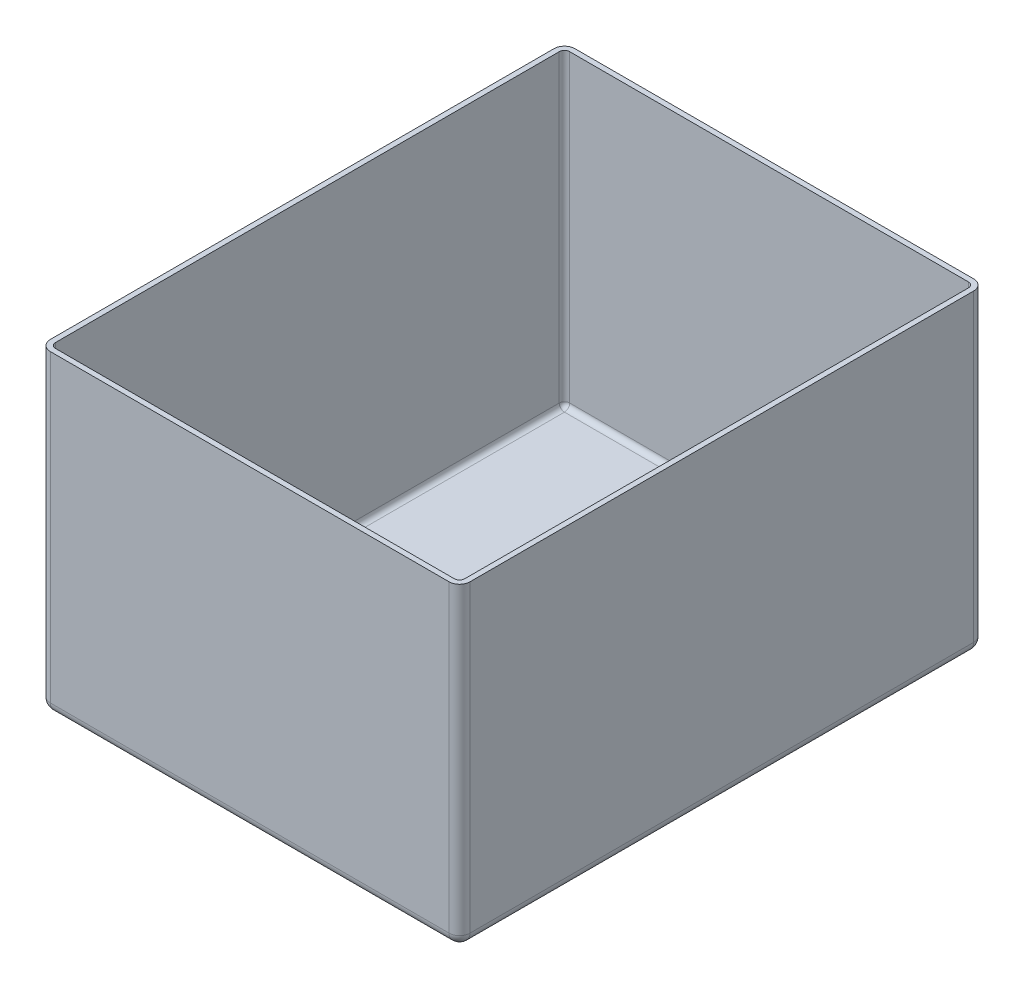
ISO-10303-21;
HEADER;
FILE_DESCRIPTION(('STEP AP214'),'2;1');
FILE_NAME('part.step','',(''),(''),'','','');
FILE_SCHEMA(('AUTOMOTIVE_DESIGN { 1 0 10303 214 1 1 1 1 }'));
ENDSEC;
DATA;
#1=APPLICATION_CONTEXT('core data for automotive mechanical design processes');
#2=APPLICATION_PROTOCOL_DEFINITION('international standard','automotive_design',2000,#1);
#3=PRODUCT_CONTEXT('',#1,'mechanical');
#4=PRODUCT('Part','Part','',(#3));
#5=PRODUCT_RELATED_PRODUCT_CATEGORY('part','',(#4));
#6=PRODUCT_DEFINITION_FORMATION('','',#4);
#7=PRODUCT_DEFINITION_CONTEXT('part definition',#1,'design');
#8=PRODUCT_DEFINITION('design','',#6,#7);
#9=PRODUCT_DEFINITION_SHAPE('','',#8);
#10=(LENGTH_UNIT() NAMED_UNIT(*) SI_UNIT(.MILLI.,.METRE.));
#11=(NAMED_UNIT(*) PLANE_ANGLE_UNIT() SI_UNIT($,.RADIAN.));
#12=(NAMED_UNIT(*) SI_UNIT($,.STERADIAN.) SOLID_ANGLE_UNIT());
#13=UNCERTAINTY_MEASURE_WITH_UNIT(LENGTH_MEASURE(1.E-05),#10,'distance_accuracy_value','');
#14=(GEOMETRIC_REPRESENTATION_CONTEXT(3) GLOBAL_UNCERTAINTY_ASSIGNED_CONTEXT((#13)) GLOBAL_UNIT_ASSIGNED_CONTEXT((#10,
#11,#12)) REPRESENTATION_CONTEXT('',''));
#15=CARTESIAN_POINT('',(0.,0.,0.));
#16=DIRECTION('',(0.,0.,1.));
#17=DIRECTION('',(1.,0.,0.));
#18=AXIS2_PLACEMENT_3D('',#15,#16,#17);
#19=CARTESIAN_POINT('',(-200.,300.,250.));
#20=DIRECTION('',(1.,0.,0.));
#21=DIRECTION('',(0.,0.,-1.));
#22=AXIS2_PLACEMENT_3D('',#19,#20,#21);
#23=PLANE('',#22);
#24=DIRECTION('',(0.,0.,1.));
#25=VECTOR('',#24,1.);
#26=CARTESIAN_POINT('',(-200.,300.,250.));
#27=LINE('',#26,#25);
#28=CARTESIAN_POINT('',(-200.,300.,-240.));
#29=VERTEX_POINT('',#28);
#30=CARTESIAN_POINT('',(-200.,300.,240.));
#31=VERTEX_POINT('',#30);
#32=EDGE_CURVE('E276',#29,#31,#27,.T.);
#33=ORIENTED_EDGE('',*,*,#32,.F.);
#34=DIRECTION('',(0.,-1.,0.));
#35=VECTOR('',#34,1.);
#36=CARTESIAN_POINT('',(-200.,300.,-240.));
#37=LINE('',#36,#35);
#38=CARTESIAN_POINT('',(-200.,10.,-240.));
#39=VERTEX_POINT('',#38);
#40=EDGE_CURVE('E56',#29,#39,#37,.T.);
#41=ORIENTED_EDGE('',*,*,#40,.T.);
#42=DIRECTION('',(0.,0.,1.));
#43=VECTOR('',#42,1.);
#44=CARTESIAN_POINT('',(-200.,10.,250.));
#45=LINE('',#44,#43);
#46=CARTESIAN_POINT('',(-200.,10.,240.));
#47=VERTEX_POINT('',#46);
#48=EDGE_CURVE('E318',#39,#47,#45,.T.);
#49=ORIENTED_EDGE('',*,*,#48,.T.);
#50=DIRECTION('',(0.,-1.,0.));
#51=VECTOR('',#50,1.);
#52=CARTESIAN_POINT('',(-200.,300.,240.));
#53=LINE('',#52,#51);
#54=EDGE_CURVE('E316',#47,#31,#53,.F.);
#55=ORIENTED_EDGE('',*,*,#54,.T.);
#56=EDGE_LOOP('',(#33,#41,#49,#55));
#57=FACE_BOUND('',#56,.T.);
#58=ADVANCED_FACE('F31',(#57),#23,.F.);
#59=CARTESIAN_POINT('',(200.,300.,250.));
#60=DIRECTION('',(0.,0.,-1.));
#61=DIRECTION('',(-1.,0.,0.));
#62=AXIS2_PLACEMENT_3D('',#59,#60,#61);
#63=PLANE('',#62);
#64=DIRECTION('',(1.,0.,0.));
#65=VECTOR('',#64,1.);
#66=CARTESIAN_POINT('',(200.,10.,250.));
#67=LINE('',#66,#65);
#68=CARTESIAN_POINT('',(-190.,10.,250.));
#69=VERTEX_POINT('',#68);
#70=CARTESIAN_POINT('',(190.,10.,250.));
#71=VERTEX_POINT('',#70);
#72=EDGE_CURVE('E290',#69,#71,#67,.T.);
#73=ORIENTED_EDGE('',*,*,#72,.T.);
#74=DIRECTION('',(0.,-1.,0.));
#75=VECTOR('',#74,1.);
#76=CARTESIAN_POINT('',(190.,300.,250.));
#77=LINE('',#76,#75);
#78=CARTESIAN_POINT('',(190.,300.,250.));
#79=VERTEX_POINT('',#78);
#80=EDGE_CURVE('E293',#71,#79,#77,.F.);
#81=ORIENTED_EDGE('',*,*,#80,.T.);
#82=DIRECTION('',(1.,0.,0.));
#83=VECTOR('',#82,1.);
#84=CARTESIAN_POINT('',(200.,300.,250.));
#85=LINE('',#84,#83);
#86=CARTESIAN_POINT('',(-190.,300.,250.));
#87=VERTEX_POINT('',#86);
#88=EDGE_CURVE('E279',#87,#79,#85,.T.);
#89=ORIENTED_EDGE('',*,*,#88,.F.);
#90=DIRECTION('',(0.,-1.,0.));
#91=VECTOR('',#90,1.);
#92=CARTESIAN_POINT('',(-190.,300.,250.));
#93=LINE('',#92,#91);
#94=EDGE_CURVE('E288',#87,#69,#93,.T.);
#95=ORIENTED_EDGE('',*,*,#94,.T.);
#96=EDGE_LOOP('',(#73,#81,#89,#95));
#97=FACE_BOUND('',#96,.T.);
#98=ADVANCED_FACE('F379',(#97),#63,.F.);
#99=CARTESIAN_POINT('',(200.,300.,250.));
#100=DIRECTION('',(-1.,0.,0.));
#101=DIRECTION('',(0.,0.,1.));
#102=AXIS2_PLACEMENT_3D('',#99,#100,#101);
#103=PLANE('',#102);
#104=DIRECTION('',(0.,0.,-1.));
#105=VECTOR('',#104,1.);
#106=CARTESIAN_POINT('',(200.,10.,250.));
#107=LINE('',#106,#105);
#108=CARTESIAN_POINT('',(200.,10.,240.));
#109=VERTEX_POINT('',#108);
#110=CARTESIAN_POINT('',(200.,10.,-240.));
#111=VERTEX_POINT('',#110);
#112=EDGE_CURVE('E306',#109,#111,#107,.T.);
#113=ORIENTED_EDGE('',*,*,#112,.T.);
#114=DIRECTION('',(0.,-1.,0.));
#115=VECTOR('',#114,1.);
#116=CARTESIAN_POINT('',(200.,300.,-240.));
#117=LINE('',#116,#115);
#118=CARTESIAN_POINT('',(200.,300.,-240.));
#119=VERTEX_POINT('',#118);
#120=EDGE_CURVE('E308',#111,#119,#117,.F.);
#121=ORIENTED_EDGE('',*,*,#120,.T.);
#122=DIRECTION('',(0.,0.,-1.));
#123=VECTOR('',#122,1.);
#124=CARTESIAN_POINT('',(200.,300.,250.));
#125=LINE('',#124,#123);
#126=CARTESIAN_POINT('',(200.,300.,240.));
#127=VERTEX_POINT('',#126);
#128=EDGE_CURVE('E282',#127,#119,#125,.T.);
#129=ORIENTED_EDGE('',*,*,#128,.F.);
#130=DIRECTION('',(0.,-1.,0.));
#131=VECTOR('',#130,1.);
#132=CARTESIAN_POINT('',(200.,300.,240.));
#133=LINE('',#132,#131);
#134=EDGE_CURVE('E304',#127,#109,#133,.T.);
#135=ORIENTED_EDGE('',*,*,#134,.T.);
#136=EDGE_LOOP('',(#113,#121,#129,#135));
#137=FACE_BOUND('',#136,.T.);
#138=ADVANCED_FACE('F389',(#137),#103,.F.);
#139=CARTESIAN_POINT('',(200.,300.,-250.));
#140=DIRECTION('',(0.,0.,1.));
#141=DIRECTION('',(1.,0.,0.));
#142=AXIS2_PLACEMENT_3D('',#139,#140,#141);
#143=PLANE('',#142);
#144=DIRECTION('',(-1.,0.,0.));
#145=VECTOR('',#144,1.);
#146=CARTESIAN_POINT('',(200.,10.,-250.));
#147=LINE('',#146,#145);
#148=CARTESIAN_POINT('',(190.,10.,-250.));
#149=VERTEX_POINT('',#148);
#150=CARTESIAN_POINT('',(-190.,10.,-250.));
#151=VERTEX_POINT('',#150);
#152=EDGE_CURVE('E312',#149,#151,#147,.T.);
#153=ORIENTED_EDGE('',*,*,#152,.T.);
#154=DIRECTION('',(0.,-1.,0.));
#155=VECTOR('',#154,1.);
#156=CARTESIAN_POINT('',(-190.,300.,-250.));
#157=LINE('',#156,#155);
#158=CARTESIAN_POINT('',(-190.,300.,-250.));
#159=VERTEX_POINT('',#158);
#160=EDGE_CURVE('E314',#151,#159,#157,.F.);
#161=ORIENTED_EDGE('',*,*,#160,.T.);
#162=DIRECTION('',(-1.,0.,0.));
#163=VECTOR('',#162,1.);
#164=CARTESIAN_POINT('',(200.,300.,-250.));
#165=LINE('',#164,#163);
#166=CARTESIAN_POINT('',(190.,300.,-250.));
#167=VERTEX_POINT('',#166);
#168=EDGE_CURVE('E285',#167,#159,#165,.T.);
#169=ORIENTED_EDGE('',*,*,#168,.F.);
#170=DIRECTION('',(0.,-1.,0.));
#171=VECTOR('',#170,1.);
#172=CARTESIAN_POINT('',(190.,300.,-250.));
#173=LINE('',#172,#171);
#174=EDGE_CURVE('E310',#167,#149,#173,.T.);
#175=ORIENTED_EDGE('',*,*,#174,.T.);
#176=EDGE_LOOP('',(#153,#161,#169,#175));
#177=FACE_BOUND('',#176,.T.);
#178=ADVANCED_FACE('F410',(#177),#143,.F.);
#179=CARTESIAN_POINT('',(-200.,300.,-250.));
#180=DIRECTION('',(0.,1.,0.));
#181=DIRECTION('',(0.,0.,1.));
#182=AXIS2_PLACEMENT_3D('',#179,#180,#181);
#183=PLANE('',#182);
#184=DIRECTION('',(-1.,0.,0.));
#185=VECTOR('',#184,1.);
#186=CARTESIAN_POINT('',(200.,300.,-245.));
#187=LINE('',#186,#185);
#188=CARTESIAN_POINT('',(190.,300.,-245.));
#189=VERTEX_POINT('',#188);
#190=CARTESIAN_POINT('',(-190.,300.,-245.));
#191=VERTEX_POINT('',#190);
#192=EDGE_CURVE('E249',#189,#191,#187,.T.);
#193=ORIENTED_EDGE('',*,*,#192,.F.);
#194=CARTESIAN_POINT('',(190.,300.,-240.));
#195=DIRECTION('',(0.,1.,0.));
#196=DIRECTION('',(0.,0.,1.));
#197=AXIS2_PLACEMENT_3D('',#194,#195,#196);
#198=CIRCLE('',#197,5.);
#199=CARTESIAN_POINT('',(195.,300.,-240.));
#200=VERTEX_POINT('',#199);
#201=EDGE_CURVE('E269',#200,#189,#198,.T.);
#202=ORIENTED_EDGE('',*,*,#201,.F.);
#203=DIRECTION('',(0.,0.,-1.));
#204=VECTOR('',#203,1.);
#205=CARTESIAN_POINT('',(195.,300.,250.));
#206=LINE('',#205,#204);
#207=CARTESIAN_POINT('',(195.,300.,240.));
#208=VERTEX_POINT('',#207);
#209=EDGE_CURVE('E48',#208,#200,#206,.T.);
#210=ORIENTED_EDGE('',*,*,#209,.F.);
#211=CARTESIAN_POINT('',(190.,300.,240.));
#212=DIRECTION('',(0.,1.,0.));
#213=DIRECTION('',(0.,0.,1.));
#214=AXIS2_PLACEMENT_3D('',#211,#212,#213);
#215=CIRCLE('',#214,5.);
#216=CARTESIAN_POINT('',(190.,300.,245.));
#217=VERTEX_POINT('',#216);
#218=EDGE_CURVE('E265',#217,#208,#215,.T.);
#219=ORIENTED_EDGE('',*,*,#218,.F.);
#220=DIRECTION('',(1.,0.,0.));
#221=VECTOR('',#220,1.);
#222=CARTESIAN_POINT('',(200.,300.,245.));
#223=LINE('',#222,#221);
#224=CARTESIAN_POINT('',(-190.,300.,245.));
#225=VERTEX_POINT('',#224);
#226=EDGE_CURVE('E263',#225,#217,#223,.T.);
#227=ORIENTED_EDGE('',*,*,#226,.F.);
#228=CARTESIAN_POINT('',(-190.,300.,240.));
#229=DIRECTION('',(0.,1.,0.));
#230=DIRECTION('',(0.,0.,1.));
#231=AXIS2_PLACEMENT_3D('',#228,#229,#230);
#232=CIRCLE('',#231,5.);
#233=CARTESIAN_POINT('',(-195.,300.,240.));
#234=VERTEX_POINT('',#233);
#235=EDGE_CURVE('E182',#234,#225,#232,.T.);
#236=ORIENTED_EDGE('',*,*,#235,.F.);
#237=DIRECTION('',(0.,0.,1.));
#238=VECTOR('',#237,1.);
#239=CARTESIAN_POINT('',(-195.,300.,250.));
#240=LINE('',#239,#238);
#241=CARTESIAN_POINT('',(-195.,300.,-240.));
#242=VERTEX_POINT('',#241);
#243=EDGE_CURVE('E239',#242,#234,#240,.T.);
#244=ORIENTED_EDGE('',*,*,#243,.F.);
#245=CARTESIAN_POINT('',(-190.,300.,-240.));
#246=DIRECTION('',(0.,1.,0.));
#247=DIRECTION('',(0.,0.,1.));
#248=AXIS2_PLACEMENT_3D('',#245,#246,#247);
#249=CIRCLE('',#248,5.);
#250=EDGE_CURVE('E177',#191,#242,#249,.T.);
#251=ORIENTED_EDGE('',*,*,#250,.F.);
#252=EDGE_LOOP('',(#193,#202,#210,#219,#227,#236,#244,#251));
#253=FACE_BOUND('',#252,.T.);
#254=ORIENTED_EDGE('',*,*,#168,.T.);
#255=CARTESIAN_POINT('',(-190.,300.,-240.));
#256=DIRECTION('',(0.,1.,0.));
#257=DIRECTION('',(0.,0.,1.));
#258=AXIS2_PLACEMENT_3D('',#255,#256,#257);
#259=CIRCLE('',#258,10.);
#260=EDGE_CURVE('E11',#159,#29,#259,.T.);
#261=ORIENTED_EDGE('',*,*,#260,.T.);
#262=ORIENTED_EDGE('',*,*,#32,.T.);
#263=CARTESIAN_POINT('',(-190.,300.,240.));
#264=DIRECTION('',(0.,1.,0.));
#265=DIRECTION('',(0.,0.,1.));
#266=AXIS2_PLACEMENT_3D('',#263,#264,#265);
#267=CIRCLE('',#266,10.);
#268=EDGE_CURVE('E321',#31,#87,#267,.T.);
#269=ORIENTED_EDGE('',*,*,#268,.T.);
#270=ORIENTED_EDGE('',*,*,#88,.T.);
#271=CARTESIAN_POINT('',(190.,300.,240.));
#272=DIRECTION('',(0.,1.,0.));
#273=DIRECTION('',(0.,0.,1.));
#274=AXIS2_PLACEMENT_3D('',#271,#272,#273);
#275=CIRCLE('',#274,10.);
#276=EDGE_CURVE('E323',#79,#127,#275,.T.);
#277=ORIENTED_EDGE('',*,*,#276,.T.);
#278=ORIENTED_EDGE('',*,*,#128,.T.);
#279=CARTESIAN_POINT('',(190.,300.,-240.));
#280=DIRECTION('',(0.,1.,0.));
#281=DIRECTION('',(0.,0.,1.));
#282=AXIS2_PLACEMENT_3D('',#279,#280,#281);
#283=CIRCLE('',#282,10.);
#284=EDGE_CURVE('E40',#119,#167,#283,.T.);
#285=ORIENTED_EDGE('',*,*,#284,.T.);
#286=EDGE_LOOP('',(#254,#261,#262,#269,#270,#277,#278,#285));
#287=FACE_BOUND('',#286,.T.);
#288=ADVANCED_FACE('F376',(#253,#287),#183,.T.);
#289=CARTESIAN_POINT('',(-200.,0.,-250.));
#290=DIRECTION('',(0.,1.,0.));
#291=DIRECTION('',(0.,0.,1.));
#292=AXIS2_PLACEMENT_3D('',#289,#290,#291);
#293=PLANE('',#292);
#294=DIRECTION('',(0.,0.,-1.));
#295=VECTOR('',#294,1.);
#296=CARTESIAN_POINT('',(190.,0.,-250.));
#297=LINE('',#296,#295);
#298=CARTESIAN_POINT('',(190.,0.,-240.));
#299=VERTEX_POINT('',#298);
#300=CARTESIAN_POINT('',(190.,0.,240.));
#301=VERTEX_POINT('',#300);
#302=EDGE_CURVE('E299',#299,#301,#297,.F.);
#303=ORIENTED_EDGE('',*,*,#302,.T.);
#304=DIRECTION('',(1.,0.,0.));
#305=VECTOR('',#304,1.);
#306=CARTESIAN_POINT('',(-200.,0.,240.));
#307=LINE('',#306,#305);
#308=CARTESIAN_POINT('',(-190.,0.,240.));
#309=VERTEX_POINT('',#308);
#310=EDGE_CURVE('E301',#301,#309,#307,.F.);
#311=ORIENTED_EDGE('',*,*,#310,.T.);
#312=DIRECTION('',(0.,0.,1.));
#313=VECTOR('',#312,1.);
#314=CARTESIAN_POINT('',(-190.,0.,-250.));
#315=LINE('',#314,#313);
#316=CARTESIAN_POINT('',(-190.,0.,-240.));
#317=VERTEX_POINT('',#316);
#318=EDGE_CURVE('E295',#309,#317,#315,.F.);
#319=ORIENTED_EDGE('',*,*,#318,.T.);
#320=DIRECTION('',(-1.,0.,0.));
#321=VECTOR('',#320,1.);
#322=CARTESIAN_POINT('',(-200.,0.,-240.));
#323=LINE('',#322,#321);
#324=EDGE_CURVE('E297',#317,#299,#323,.F.);
#325=ORIENTED_EDGE('',*,*,#324,.T.);
#326=EDGE_LOOP('',(#303,#311,#319,#325));
#327=FACE_BOUND('',#326,.T.);
#328=ADVANCED_FACE('F406',(#327),#293,.F.);
#329=CARTESIAN_POINT('',(-190.,300.,-240.));
#330=DIRECTION('',(0.,-1.,0.));
#331=DIRECTION('',(0.,0.,-1.));
#332=AXIS2_PLACEMENT_3D('',#329,#330,#331);
#333=CYLINDRICAL_SURFACE('',#332,10.);
#334=ORIENTED_EDGE('',*,*,#260,.F.);
#335=ORIENTED_EDGE('',*,*,#160,.F.);
#336=CARTESIAN_POINT('',(-190.,10.,-240.));
#337=DIRECTION('',(0.,-1.,0.));
#338=DIRECTION('',(0.,0.,-1.));
#339=AXIS2_PLACEMENT_3D('',#336,#337,#338);
#340=CIRCLE('',#339,10.);
#341=EDGE_CURVE('E352',#39,#151,#340,.T.);
#342=ORIENTED_EDGE('',*,*,#341,.F.);
#343=ORIENTED_EDGE('',*,*,#40,.F.);
#344=EDGE_LOOP('',(#334,#335,#342,#343));
#345=FACE_BOUND('',#344,.T.);
#346=ADVANCED_FACE('F33',(#345),#333,.T.);
#347=CARTESIAN_POINT('',(190.,300.,-240.));
#348=DIRECTION('',(0.,-1.,0.));
#349=DIRECTION('',(0.,0.,-1.));
#350=AXIS2_PLACEMENT_3D('',#347,#348,#349);
#351=CYLINDRICAL_SURFACE('',#350,10.);
#352=ORIENTED_EDGE('',*,*,#284,.F.);
#353=ORIENTED_EDGE('',*,*,#120,.F.);
#354=CARTESIAN_POINT('',(190.,10.,-240.));
#355=DIRECTION('',(0.,-1.,0.));
#356=DIRECTION('',(0.,0.,-1.));
#357=AXIS2_PLACEMENT_3D('',#354,#355,#356);
#358=CIRCLE('',#357,10.);
#359=EDGE_CURVE('E350',#149,#111,#358,.T.);
#360=ORIENTED_EDGE('',*,*,#359,.F.);
#361=ORIENTED_EDGE('',*,*,#174,.F.);
#362=EDGE_LOOP('',(#352,#353,#360,#361));
#363=FACE_BOUND('',#362,.T.);
#364=ADVANCED_FACE('F394',(#363),#351,.T.);
#365=CARTESIAN_POINT('',(200.,10.,-240.));
#366=DIRECTION('',(-1.,0.,0.));
#367=DIRECTION('',(0.,0.,1.));
#368=AXIS2_PLACEMENT_3D('',#365,#366,#367);
#369=CYLINDRICAL_SURFACE('',#368,10.);
#370=CARTESIAN_POINT('',(-190.,10.,-240.));
#371=DIRECTION('',(-1.,0.,0.));
#372=DIRECTION('',(0.,0.,1.));
#373=AXIS2_PLACEMENT_3D('',#370,#371,#372);
#374=CIRCLE('',#373,10.);
#375=EDGE_CURVE('E35',#151,#317,#374,.T.);
#376=ORIENTED_EDGE('',*,*,#375,.F.);
#377=ORIENTED_EDGE('',*,*,#152,.F.);
#378=CARTESIAN_POINT('',(190.,10.,-240.));
#379=DIRECTION('',(1.,0.,0.));
#380=DIRECTION('',(0.,0.,-1.));
#381=AXIS2_PLACEMENT_3D('',#378,#379,#380);
#382=CIRCLE('',#381,10.);
#383=EDGE_CURVE('E347',#299,#149,#382,.T.);
#384=ORIENTED_EDGE('',*,*,#383,.F.);
#385=ORIENTED_EDGE('',*,*,#324,.F.);
#386=EDGE_LOOP('',(#376,#377,#384,#385));
#387=FACE_BOUND('',#386,.T.);
#388=ADVANCED_FACE('F407',(#387),#369,.T.);
#389=CARTESIAN_POINT('',(-190.,10.,-240.));
#390=DIRECTION('',(0.,0.,1.));
#391=DIRECTION('',(1.,0.,0.));
#392=AXIS2_PLACEMENT_3D('',#389,#390,#391);
#393=SPHERICAL_SURFACE('',#392,10.);
#394=ORIENTED_EDGE('',*,*,#341,.T.);
#395=ORIENTED_EDGE('',*,*,#375,.T.);
#396=CARTESIAN_POINT('',(-190.,10.,-240.));
#397=DIRECTION('',(0.,0.,-1.));
#398=DIRECTION('',(-1.,0.,0.));
#399=AXIS2_PLACEMENT_3D('',#396,#397,#398);
#400=CIRCLE('',#399,10.);
#401=EDGE_CURVE('E344',#39,#317,#400,.F.);
#402=ORIENTED_EDGE('',*,*,#401,.F.);
#403=EDGE_LOOP('',(#394,#395,#402));
#404=FACE_BOUND('',#403,.T.);
#405=ADVANCED_FACE('F358',(#404),#393,.T.);
#406=CARTESIAN_POINT('',(190.,10.,-240.));
#407=DIRECTION('',(0.,0.,1.));
#408=DIRECTION('',(1.,0.,0.));
#409=AXIS2_PLACEMENT_3D('',#406,#407,#408);
#410=SPHERICAL_SURFACE('',#409,10.);
#411=ORIENTED_EDGE('',*,*,#383,.T.);
#412=ORIENTED_EDGE('',*,*,#359,.T.);
#413=CARTESIAN_POINT('',(190.,10.,-240.));
#414=DIRECTION('',(0.,0.,-1.));
#415=DIRECTION('',(-1.,0.,0.));
#416=AXIS2_PLACEMENT_3D('',#413,#414,#415);
#417=CIRCLE('',#416,10.);
#418=EDGE_CURVE('E341',#299,#111,#417,.F.);
#419=ORIENTED_EDGE('',*,*,#418,.F.);
#420=EDGE_LOOP('',(#411,#412,#419));
#421=FACE_BOUND('',#420,.T.);
#422=ADVANCED_FACE('F398',(#421),#410,.T.);
#423=CARTESIAN_POINT('',(-190.,10.,250.));
#424=DIRECTION('',(0.,0.,1.));
#425=DIRECTION('',(1.,0.,0.));
#426=AXIS2_PLACEMENT_3D('',#423,#424,#425);
#427=CYLINDRICAL_SURFACE('',#426,10.);
#428=ORIENTED_EDGE('',*,*,#401,.T.);
#429=ORIENTED_EDGE('',*,*,#318,.F.);
#430=CARTESIAN_POINT('',(-190.,10.,240.));
#431=DIRECTION('',(0.,0.,1.));
#432=DIRECTION('',(1.,0.,0.));
#433=AXIS2_PLACEMENT_3D('',#430,#431,#432);
#434=CIRCLE('',#433,10.);
#435=EDGE_CURVE('E338',#47,#309,#434,.T.);
#436=ORIENTED_EDGE('',*,*,#435,.F.);
#437=ORIENTED_EDGE('',*,*,#48,.F.);
#438=EDGE_LOOP('',(#428,#429,#436,#437));
#439=FACE_BOUND('',#438,.T.);
#440=ADVANCED_FACE('F365',(#439),#427,.T.);
#441=CARTESIAN_POINT('',(-190.,300.,240.));
#442=DIRECTION('',(0.,-1.,0.));
#443=DIRECTION('',(0.,0.,-1.));
#444=AXIS2_PLACEMENT_3D('',#441,#442,#443);
#445=CYLINDRICAL_SURFACE('',#444,10.);
#446=ORIENTED_EDGE('',*,*,#268,.F.);
#447=ORIENTED_EDGE('',*,*,#54,.F.);
#448=CARTESIAN_POINT('',(-190.,10.,240.));
#449=DIRECTION('',(0.,-1.,0.));
#450=DIRECTION('',(0.,0.,-1.));
#451=AXIS2_PLACEMENT_3D('',#448,#449,#450);
#452=CIRCLE('',#451,10.);
#453=EDGE_CURVE('E335',#69,#47,#452,.T.);
#454=ORIENTED_EDGE('',*,*,#453,.F.);
#455=ORIENTED_EDGE('',*,*,#94,.F.);
#456=EDGE_LOOP('',(#446,#447,#454,#455));
#457=FACE_BOUND('',#456,.T.);
#458=ADVANCED_FACE('F371',(#457),#445,.T.);
#459=CARTESIAN_POINT('',(190.,300.,240.));
#460=DIRECTION('',(0.,-1.,0.));
#461=DIRECTION('',(0.,0.,-1.));
#462=AXIS2_PLACEMENT_3D('',#459,#460,#461);
#463=CYLINDRICAL_SURFACE('',#462,10.);
#464=ORIENTED_EDGE('',*,*,#276,.F.);
#465=ORIENTED_EDGE('',*,*,#80,.F.);
#466=CARTESIAN_POINT('',(190.,10.,240.));
#467=DIRECTION('',(0.,-1.,0.));
#468=DIRECTION('',(0.,0.,-1.));
#469=AXIS2_PLACEMENT_3D('',#466,#467,#468);
#470=CIRCLE('',#469,10.);
#471=EDGE_CURVE('E332',#109,#71,#470,.T.);
#472=ORIENTED_EDGE('',*,*,#471,.F.);
#473=ORIENTED_EDGE('',*,*,#134,.F.);
#474=EDGE_LOOP('',(#464,#465,#472,#473));
#475=FACE_BOUND('',#474,.T.);
#476=ADVANCED_FACE('F384',(#475),#463,.T.);
#477=CARTESIAN_POINT('',(190.,10.,250.));
#478=DIRECTION('',(0.,0.,-1.));
#479=DIRECTION('',(-1.,0.,0.));
#480=AXIS2_PLACEMENT_3D('',#477,#478,#479);
#481=CYLINDRICAL_SURFACE('',#480,10.);
#482=ORIENTED_EDGE('',*,*,#418,.T.);
#483=ORIENTED_EDGE('',*,*,#112,.F.);
#484=CARTESIAN_POINT('',(190.,10.,240.));
#485=DIRECTION('',(0.,0.,1.));
#486=DIRECTION('',(1.,0.,0.));
#487=AXIS2_PLACEMENT_3D('',#484,#485,#486);
#488=CIRCLE('',#487,10.);
#489=EDGE_CURVE('E329',#301,#109,#488,.T.);
#490=ORIENTED_EDGE('',*,*,#489,.F.);
#491=ORIENTED_EDGE('',*,*,#302,.F.);
#492=EDGE_LOOP('',(#482,#483,#490,#491));
#493=FACE_BOUND('',#492,.T.);
#494=ADVANCED_FACE('F402',(#493),#481,.T.);
#495=CARTESIAN_POINT('',(-190.,10.,240.));
#496=DIRECTION('',(0.,0.,1.));
#497=DIRECTION('',(1.,0.,0.));
#498=AXIS2_PLACEMENT_3D('',#495,#496,#497);
#499=SPHERICAL_SURFACE('',#498,10.);
#500=ORIENTED_EDGE('',*,*,#453,.T.);
#501=ORIENTED_EDGE('',*,*,#435,.T.);
#502=CARTESIAN_POINT('',(-190.,10.,240.));
#503=DIRECTION('',(-1.,0.,0.));
#504=DIRECTION('',(0.,0.,1.));
#505=AXIS2_PLACEMENT_3D('',#502,#503,#504);
#506=CIRCLE('',#505,10.);
#507=EDGE_CURVE('E327',#69,#309,#506,.F.);
#508=ORIENTED_EDGE('',*,*,#507,.F.);
#509=EDGE_LOOP('',(#500,#501,#508));
#510=FACE_BOUND('',#509,.T.);
#511=ADVANCED_FACE('F435',(#510),#499,.T.);
#512=CARTESIAN_POINT('',(190.,10.,240.));
#513=DIRECTION('',(0.,0.,1.));
#514=DIRECTION('',(1.,0.,0.));
#515=AXIS2_PLACEMENT_3D('',#512,#513,#514);
#516=SPHERICAL_SURFACE('',#515,10.);
#517=ORIENTED_EDGE('',*,*,#489,.T.);
#518=ORIENTED_EDGE('',*,*,#471,.T.);
#519=CARTESIAN_POINT('',(190.,10.,240.));
#520=DIRECTION('',(1.,0.,0.));
#521=DIRECTION('',(0.,0.,-1.));
#522=AXIS2_PLACEMENT_3D('',#519,#520,#521);
#523=CIRCLE('',#522,10.);
#524=EDGE_CURVE('E275',#301,#71,#523,.F.);
#525=ORIENTED_EDGE('',*,*,#524,.F.);
#526=EDGE_LOOP('',(#517,#518,#525));
#527=FACE_BOUND('',#526,.T.);
#528=ADVANCED_FACE('F431',(#527),#516,.T.);
#529=CARTESIAN_POINT('',(200.,10.,240.));
#530=DIRECTION('',(1.,0.,0.));
#531=DIRECTION('',(0.,0.,-1.));
#532=AXIS2_PLACEMENT_3D('',#529,#530,#531);
#533=CYLINDRICAL_SURFACE('',#532,10.);
#534=ORIENTED_EDGE('',*,*,#507,.T.);
#535=ORIENTED_EDGE('',*,*,#310,.F.);
#536=ORIENTED_EDGE('',*,*,#524,.T.);
#537=ORIENTED_EDGE('',*,*,#72,.F.);
#538=EDGE_LOOP('',(#534,#535,#536,#537));
#539=FACE_BOUND('',#538,.T.);
#540=ADVANCED_FACE('F428',(#539),#533,.T.);
#541=CARTESIAN_POINT('',(-195.,300.,250.));
#542=DIRECTION('',(1.,0.,0.));
#543=DIRECTION('',(0.,0.,-1.));
#544=AXIS2_PLACEMENT_3D('',#541,#542,#543);
#545=PLANE('',#544);
#546=ORIENTED_EDGE('',*,*,#243,.T.);
#547=DIRECTION('',(0.,1.,0.));
#548=VECTOR('',#547,1.);
#549=CARTESIAN_POINT('',(-195.,300.,240.));
#550=LINE('',#549,#548);
#551=CARTESIAN_POINT('',(-195.,10.,240.));
#552=VERTEX_POINT('',#551);
#553=EDGE_CURVE('E206',#552,#234,#550,.T.);
#554=ORIENTED_EDGE('',*,*,#553,.F.);
#555=DIRECTION('',(0.,0.,-1.));
#556=VECTOR('',#555,1.);
#557=CARTESIAN_POINT('',(-195.,10.,250.));
#558=LINE('',#557,#556);
#559=CARTESIAN_POINT('',(-195.,10.,-240.));
#560=VERTEX_POINT('',#559);
#561=EDGE_CURVE('E183',#560,#552,#558,.F.);
#562=ORIENTED_EDGE('',*,*,#561,.F.);
#563=DIRECTION('',(0.,1.,0.));
#564=VECTOR('',#563,1.);
#565=CARTESIAN_POINT('',(-195.,300.,-240.));
#566=LINE('',#565,#564);
#567=EDGE_CURVE('E172',#242,#560,#566,.F.);
#568=ORIENTED_EDGE('',*,*,#567,.F.);
#569=EDGE_LOOP('',(#546,#554,#562,#568));
#570=FACE_BOUND('',#569,.T.);
#571=ADVANCED_FACE('F205',(#570),#545,.T.);
#572=CARTESIAN_POINT('',(200.,300.,245.));
#573=DIRECTION('',(0.,0.,-1.));
#574=DIRECTION('',(-1.,0.,0.));
#575=AXIS2_PLACEMENT_3D('',#572,#573,#574);
#576=PLANE('',#575);
#577=DIRECTION('',(-1.,0.,0.));
#578=VECTOR('',#577,1.);
#579=CARTESIAN_POINT('',(200.,10.,245.));
#580=LINE('',#579,#578);
#581=CARTESIAN_POINT('',(-190.,10.,245.));
#582=VERTEX_POINT('',#581);
#583=CARTESIAN_POINT('',(190.,10.,245.));
#584=VERTEX_POINT('',#583);
#585=EDGE_CURVE('E248',#582,#584,#580,.F.);
#586=ORIENTED_EDGE('',*,*,#585,.F.);
#587=DIRECTION('',(0.,1.,0.));
#588=VECTOR('',#587,1.);
#589=CARTESIAN_POINT('',(-190.,300.,245.));
#590=LINE('',#589,#588);
#591=EDGE_CURVE('E246',#225,#582,#590,.F.);
#592=ORIENTED_EDGE('',*,*,#591,.F.);
#593=ORIENTED_EDGE('',*,*,#226,.T.);
#594=DIRECTION('',(0.,1.,0.));
#595=VECTOR('',#594,1.);
#596=CARTESIAN_POINT('',(190.,300.,245.));
#597=LINE('',#596,#595);
#598=EDGE_CURVE('E237',#584,#217,#597,.T.);
#599=ORIENTED_EDGE('',*,*,#598,.F.);
#600=EDGE_LOOP('',(#586,#592,#593,#599));
#601=FACE_BOUND('',#600,.T.);
#602=ADVANCED_FACE('F500',(#601),#576,.T.);
#603=CARTESIAN_POINT('',(195.,300.,250.));
#604=DIRECTION('',(-1.,0.,0.));
#605=DIRECTION('',(0.,0.,1.));
#606=AXIS2_PLACEMENT_3D('',#603,#604,#605);
#607=PLANE('',#606);
#608=DIRECTION('',(0.,0.,1.));
#609=VECTOR('',#608,1.);
#610=CARTESIAN_POINT('',(195.,10.,250.));
#611=LINE('',#610,#609);
#612=CARTESIAN_POINT('',(195.,10.,240.));
#613=VERTEX_POINT('',#612);
#614=CARTESIAN_POINT('',(195.,10.,-240.));
#615=VERTEX_POINT('',#614);
#616=EDGE_CURVE('E219',#613,#615,#611,.F.);
#617=ORIENTED_EDGE('',*,*,#616,.F.);
#618=DIRECTION('',(0.,1.,0.));
#619=VECTOR('',#618,1.);
#620=CARTESIAN_POINT('',(195.,300.,240.));
#621=LINE('',#620,#619);
#622=EDGE_CURVE('E223',#208,#613,#621,.F.);
#623=ORIENTED_EDGE('',*,*,#622,.F.);
#624=ORIENTED_EDGE('',*,*,#209,.T.);
#625=DIRECTION('',(0.,1.,0.));
#626=VECTOR('',#625,1.);
#627=CARTESIAN_POINT('',(195.,300.,-240.));
#628=LINE('',#627,#626);
#629=EDGE_CURVE('E217',#615,#200,#628,.T.);
#630=ORIENTED_EDGE('',*,*,#629,.F.);
#631=EDGE_LOOP('',(#617,#623,#624,#630));
#632=FACE_BOUND('',#631,.T.);
#633=ADVANCED_FACE('F507',(#632),#607,.T.);
#634=CARTESIAN_POINT('',(200.,300.,-245.));
#635=DIRECTION('',(0.,0.,1.));
#636=DIRECTION('',(1.,0.,0.));
#637=AXIS2_PLACEMENT_3D('',#634,#635,#636);
#638=PLANE('',#637);
#639=DIRECTION('',(1.,0.,0.));
#640=VECTOR('',#639,1.);
#641=CARTESIAN_POINT('',(200.,10.,-245.));
#642=LINE('',#641,#640);
#643=CARTESIAN_POINT('',(190.,10.,-245.));
#644=VERTEX_POINT('',#643);
#645=CARTESIAN_POINT('',(-190.,10.,-245.));
#646=VERTEX_POINT('',#645);
#647=EDGE_CURVE('E212',#644,#646,#642,.F.);
#648=ORIENTED_EDGE('',*,*,#647,.F.);
#649=DIRECTION('',(0.,1.,0.));
#650=VECTOR('',#649,1.);
#651=CARTESIAN_POINT('',(190.,300.,-245.));
#652=LINE('',#651,#650);
#653=EDGE_CURVE('E215',#189,#644,#652,.F.);
#654=ORIENTED_EDGE('',*,*,#653,.F.);
#655=ORIENTED_EDGE('',*,*,#192,.T.);
#656=DIRECTION('',(0.,1.,0.));
#657=VECTOR('',#656,1.);
#658=CARTESIAN_POINT('',(-190.,300.,-245.));
#659=LINE('',#658,#657);
#660=EDGE_CURVE('E209',#646,#191,#659,.T.);
#661=ORIENTED_EDGE('',*,*,#660,.F.);
#662=EDGE_LOOP('',(#648,#654,#655,#661));
#663=FACE_BOUND('',#662,.T.);
#664=ADVANCED_FACE('F515',(#663),#638,.T.);
#665=CARTESIAN_POINT('',(-200.,5.,-250.));
#666=DIRECTION('',(0.,1.,0.));
#667=DIRECTION('',(0.,0.,1.));
#668=AXIS2_PLACEMENT_3D('',#665,#666,#667);
#669=PLANE('',#668);
#670=DIRECTION('',(0.,0.,1.));
#671=VECTOR('',#670,1.);
#672=CARTESIAN_POINT('',(190.,5.,-250.));
#673=LINE('',#672,#671);
#674=CARTESIAN_POINT('',(190.,5.,-240.));
#675=VERTEX_POINT('',#674);
#676=CARTESIAN_POINT('',(190.,5.,240.));
#677=VERTEX_POINT('',#676);
#678=EDGE_CURVE('E231',#675,#677,#673,.T.);
#679=ORIENTED_EDGE('',*,*,#678,.F.);
#680=DIRECTION('',(1.,0.,0.));
#681=VECTOR('',#680,1.);
#682=CARTESIAN_POINT('',(-200.,5.,-240.));
#683=LINE('',#682,#681);
#684=CARTESIAN_POINT('',(-190.,5.,-240.));
#685=VERTEX_POINT('',#684);
#686=EDGE_CURVE('E233',#685,#675,#683,.T.);
#687=ORIENTED_EDGE('',*,*,#686,.F.);
#688=DIRECTION('',(0.,0.,1.));
#689=VECTOR('',#688,1.);
#690=CARTESIAN_POINT('',(-190.,5.,-250.));
#691=LINE('',#690,#689);
#692=CARTESIAN_POINT('',(-190.,5.00000000000001,240.));
#693=VERTEX_POINT('',#692);
#694=EDGE_CURVE('E200',#693,#685,#691,.F.);
#695=ORIENTED_EDGE('',*,*,#694,.F.);
#696=DIRECTION('',(1.,0.,0.));
#697=VECTOR('',#696,1.);
#698=CARTESIAN_POINT('',(-200.,5.,240.));
#699=LINE('',#698,#697);
#700=EDGE_CURVE('E225',#677,#693,#699,.F.);
#701=ORIENTED_EDGE('',*,*,#700,.F.);
#702=EDGE_LOOP('',(#679,#687,#695,#701));
#703=FACE_BOUND('',#702,.T.);
#704=ADVANCED_FACE('F522',(#703),#669,.T.);
#705=CARTESIAN_POINT('',(-190.,300.,-240.));
#706=DIRECTION('',(0.,-1.,0.));
#707=DIRECTION('',(0.,0.,-1.));
#708=AXIS2_PLACEMENT_3D('',#705,#706,#707);
#709=CYLINDRICAL_SURFACE('',#708,5.);
#710=ORIENTED_EDGE('',*,*,#250,.T.);
#711=ORIENTED_EDGE('',*,*,#567,.T.);
#712=CARTESIAN_POINT('',(-190.,10.,-240.));
#713=DIRECTION('',(0.,1.,0.));
#714=DIRECTION('',(-1.,0.,0.));
#715=AXIS2_PLACEMENT_3D('',#712,#713,#714);
#716=CIRCLE('',#715,5.);
#717=EDGE_CURVE('E175',#560,#646,#716,.F.);
#718=ORIENTED_EDGE('',*,*,#717,.T.);
#719=ORIENTED_EDGE('',*,*,#660,.T.);
#720=EDGE_LOOP('',(#710,#711,#718,#719));
#721=FACE_BOUND('',#720,.T.);
#722=ADVANCED_FACE('F174',(#721),#709,.F.);
#723=CARTESIAN_POINT('',(190.,300.,-240.));
#724=DIRECTION('',(0.,-1.,0.));
#725=DIRECTION('',(0.,0.,-1.));
#726=AXIS2_PLACEMENT_3D('',#723,#724,#725);
#727=CYLINDRICAL_SURFACE('',#726,5.);
#728=ORIENTED_EDGE('',*,*,#201,.T.);
#729=ORIENTED_EDGE('',*,*,#653,.T.);
#730=CARTESIAN_POINT('',(190.,10.,-240.));
#731=DIRECTION('',(0.,-1.,0.));
#732=DIRECTION('',(1.,0.,0.));
#733=AXIS2_PLACEMENT_3D('',#730,#731,#732);
#734=CIRCLE('',#733,5.);
#735=EDGE_CURVE('E193',#644,#615,#734,.T.);
#736=ORIENTED_EDGE('',*,*,#735,.T.);
#737=ORIENTED_EDGE('',*,*,#629,.T.);
#738=EDGE_LOOP('',(#728,#729,#736,#737));
#739=FACE_BOUND('',#738,.T.);
#740=ADVANCED_FACE('F537',(#739),#727,.F.);
#741=CARTESIAN_POINT('',(200.,10.,-240.));
#742=DIRECTION('',(-1.,0.,0.));
#743=DIRECTION('',(0.,0.,1.));
#744=AXIS2_PLACEMENT_3D('',#741,#742,#743);
#745=CYLINDRICAL_SURFACE('',#744,5.);
#746=CARTESIAN_POINT('',(-190.,10.,-240.));
#747=DIRECTION('',(-1.,0.,0.));
#748=DIRECTION('',(0.,-1.,0.));
#749=AXIS2_PLACEMENT_3D('',#746,#747,#748);
#750=CIRCLE('',#749,5.);
#751=EDGE_CURVE('E192',#646,#685,#750,.T.);
#752=ORIENTED_EDGE('',*,*,#751,.T.);
#753=ORIENTED_EDGE('',*,*,#686,.T.);
#754=CARTESIAN_POINT('',(190.,10.,-240.));
#755=DIRECTION('',(-1.,0.,0.));
#756=DIRECTION('',(0.,-1.,0.));
#757=AXIS2_PLACEMENT_3D('',#754,#755,#756);
#758=CIRCLE('',#757,5.);
#759=EDGE_CURVE('E202',#675,#644,#758,.F.);
#760=ORIENTED_EDGE('',*,*,#759,.T.);
#761=ORIENTED_EDGE('',*,*,#647,.T.);
#762=EDGE_LOOP('',(#752,#753,#760,#761));
#763=FACE_BOUND('',#762,.T.);
#764=ADVANCED_FACE('F544',(#763),#745,.F.);
#765=CARTESIAN_POINT('',(-190.,10.,-240.));
#766=DIRECTION('',(0.,0.,1.));
#767=DIRECTION('',(1.,0.,0.));
#768=AXIS2_PLACEMENT_3D('',#765,#766,#767);
#769=SPHERICAL_SURFACE('',#768,5.);
#770=ORIENTED_EDGE('',*,*,#717,.F.);
#771=CARTESIAN_POINT('',(-190.,10.,-240.));
#772=DIRECTION('',(0.,0.,1.));
#773=DIRECTION('',(1.,0.,0.));
#774=AXIS2_PLACEMENT_3D('',#771,#772,#773);
#775=CIRCLE('',#774,5.);
#776=EDGE_CURVE('E190',#560,#685,#775,.T.);
#777=ORIENTED_EDGE('',*,*,#776,.T.);
#778=ORIENTED_EDGE('',*,*,#751,.F.);
#779=EDGE_LOOP('',(#770,#777,#778));
#780=FACE_BOUND('',#779,.T.);
#781=ADVANCED_FACE('F189',(#780),#769,.F.);
#782=CARTESIAN_POINT('',(190.,10.,-240.));
#783=DIRECTION('',(0.,0.,1.));
#784=DIRECTION('',(1.,0.,0.));
#785=AXIS2_PLACEMENT_3D('',#782,#783,#784);
#786=SPHERICAL_SURFACE('',#785,5.);
#787=ORIENTED_EDGE('',*,*,#759,.F.);
#788=CARTESIAN_POINT('',(190.,10.,-240.));
#789=DIRECTION('',(0.,0.,-1.));
#790=DIRECTION('',(-1.,0.,0.));
#791=AXIS2_PLACEMENT_3D('',#788,#789,#790);
#792=CIRCLE('',#791,5.);
#793=EDGE_CURVE('E203',#675,#615,#792,.F.);
#794=ORIENTED_EDGE('',*,*,#793,.T.);
#795=ORIENTED_EDGE('',*,*,#735,.F.);
#796=EDGE_LOOP('',(#787,#794,#795));
#797=FACE_BOUND('',#796,.T.);
#798=ADVANCED_FACE('F559',(#797),#786,.F.);
#799=CARTESIAN_POINT('',(-190.,10.,250.));
#800=DIRECTION('',(0.,0.,1.));
#801=DIRECTION('',(1.,0.,0.));
#802=AXIS2_PLACEMENT_3D('',#799,#800,#801);
#803=CYLINDRICAL_SURFACE('',#802,5.);
#804=ORIENTED_EDGE('',*,*,#776,.F.);
#805=ORIENTED_EDGE('',*,*,#561,.T.);
#806=CARTESIAN_POINT('',(-190.,10.,240.));
#807=DIRECTION('',(0.,0.,1.));
#808=DIRECTION('',(1.,0.,0.));
#809=AXIS2_PLACEMENT_3D('',#806,#807,#808);
#810=CIRCLE('',#809,5.);
#811=EDGE_CURVE('E230',#552,#693,#810,.T.);
#812=ORIENTED_EDGE('',*,*,#811,.T.);
#813=ORIENTED_EDGE('',*,*,#694,.T.);
#814=EDGE_LOOP('',(#804,#805,#812,#813));
#815=FACE_BOUND('',#814,.T.);
#816=ADVANCED_FACE('F196',(#815),#803,.F.);
#817=CARTESIAN_POINT('',(-190.,300.,240.));
#818=DIRECTION('',(0.,-1.,0.));
#819=DIRECTION('',(0.,0.,-1.));
#820=AXIS2_PLACEMENT_3D('',#817,#818,#819);
#821=CYLINDRICAL_SURFACE('',#820,5.);
#822=ORIENTED_EDGE('',*,*,#235,.T.);
#823=ORIENTED_EDGE('',*,*,#591,.T.);
#824=CARTESIAN_POINT('',(-190.,10.,240.));
#825=DIRECTION('',(0.,1.,0.));
#826=DIRECTION('',(-1.,0.,0.));
#827=AXIS2_PLACEMENT_3D('',#824,#825,#826);
#828=CIRCLE('',#827,5.);
#829=EDGE_CURVE('E242',#582,#552,#828,.F.);
#830=ORIENTED_EDGE('',*,*,#829,.T.);
#831=ORIENTED_EDGE('',*,*,#553,.T.);
#832=EDGE_LOOP('',(#822,#823,#830,#831));
#833=FACE_BOUND('',#832,.T.);
#834=ADVANCED_FACE('F573',(#833),#821,.F.);
#835=CARTESIAN_POINT('',(190.,300.,240.));
#836=DIRECTION('',(0.,-1.,0.));
#837=DIRECTION('',(0.,0.,-1.));
#838=AXIS2_PLACEMENT_3D('',#835,#836,#837);
#839=CYLINDRICAL_SURFACE('',#838,5.);
#840=ORIENTED_EDGE('',*,*,#218,.T.);
#841=ORIENTED_EDGE('',*,*,#622,.T.);
#842=CARTESIAN_POINT('',(190.,10.,240.));
#843=DIRECTION('',(0.,-1.,0.));
#844=DIRECTION('',(1.,0.,0.));
#845=AXIS2_PLACEMENT_3D('',#842,#843,#844);
#846=CIRCLE('',#845,5.);
#847=EDGE_CURVE('E245',#613,#584,#846,.T.);
#848=ORIENTED_EDGE('',*,*,#847,.T.);
#849=ORIENTED_EDGE('',*,*,#598,.T.);
#850=EDGE_LOOP('',(#840,#841,#848,#849));
#851=FACE_BOUND('',#850,.T.);
#852=ADVANCED_FACE('F580',(#851),#839,.F.);
#853=CARTESIAN_POINT('',(190.,10.,250.));
#854=DIRECTION('',(0.,0.,-1.));
#855=DIRECTION('',(-1.,0.,0.));
#856=AXIS2_PLACEMENT_3D('',#853,#854,#855);
#857=CYLINDRICAL_SURFACE('',#856,5.);
#858=ORIENTED_EDGE('',*,*,#793,.F.);
#859=ORIENTED_EDGE('',*,*,#678,.T.);
#860=CARTESIAN_POINT('',(190.,10.,240.));
#861=DIRECTION('',(0.,0.,1.));
#862=DIRECTION('',(1.,0.,0.));
#863=AXIS2_PLACEMENT_3D('',#860,#861,#862);
#864=CIRCLE('',#863,5.);
#865=EDGE_CURVE('E255',#677,#613,#864,.T.);
#866=ORIENTED_EDGE('',*,*,#865,.T.);
#867=ORIENTED_EDGE('',*,*,#616,.T.);
#868=EDGE_LOOP('',(#858,#859,#866,#867));
#869=FACE_BOUND('',#868,.T.);
#870=ADVANCED_FACE('F588',(#869),#857,.F.);
#871=CARTESIAN_POINT('',(-190.,10.,240.));
#872=DIRECTION('',(0.,0.,1.));
#873=DIRECTION('',(1.,0.,0.));
#874=AXIS2_PLACEMENT_3D('',#871,#872,#873);
#875=SPHERICAL_SURFACE('',#874,5.);
#876=ORIENTED_EDGE('',*,*,#829,.F.);
#877=CARTESIAN_POINT('',(-190.,10.,240.));
#878=DIRECTION('',(1.,0.,0.));
#879=DIRECTION('',(0.,0.,-1.));
#880=AXIS2_PLACEMENT_3D('',#877,#878,#879);
#881=CIRCLE('',#880,5.);
#882=EDGE_CURVE('E258',#582,#693,#881,.T.);
#883=ORIENTED_EDGE('',*,*,#882,.T.);
#884=ORIENTED_EDGE('',*,*,#811,.F.);
#885=EDGE_LOOP('',(#876,#883,#884));
#886=FACE_BOUND('',#885,.T.);
#887=ADVANCED_FACE('F596',(#886),#875,.F.);
#888=CARTESIAN_POINT('',(190.,10.,240.));
#889=DIRECTION('',(0.,0.,1.));
#890=DIRECTION('',(1.,0.,0.));
#891=AXIS2_PLACEMENT_3D('',#888,#889,#890);
#892=SPHERICAL_SURFACE('',#891,5.);
#893=ORIENTED_EDGE('',*,*,#865,.F.);
#894=CARTESIAN_POINT('',(190.,10.,240.));
#895=DIRECTION('',(1.,0.,0.));
#896=DIRECTION('',(0.,0.,-1.));
#897=AXIS2_PLACEMENT_3D('',#894,#895,#896);
#898=CIRCLE('',#897,5.);
#899=EDGE_CURVE('E259',#677,#584,#898,.F.);
#900=ORIENTED_EDGE('',*,*,#899,.T.);
#901=ORIENTED_EDGE('',*,*,#847,.F.);
#902=EDGE_LOOP('',(#893,#900,#901));
#903=FACE_BOUND('',#902,.T.);
#904=ADVANCED_FACE('F604',(#903),#892,.F.);
#905=CARTESIAN_POINT('',(200.,10.,240.));
#906=DIRECTION('',(1.,0.,0.));
#907=DIRECTION('',(0.,0.,-1.));
#908=AXIS2_PLACEMENT_3D('',#905,#906,#907);
#909=CYLINDRICAL_SURFACE('',#908,5.);
#910=ORIENTED_EDGE('',*,*,#882,.F.);
#911=ORIENTED_EDGE('',*,*,#585,.T.);
#912=ORIENTED_EDGE('',*,*,#899,.F.);
#913=ORIENTED_EDGE('',*,*,#700,.T.);
#914=EDGE_LOOP('',(#910,#911,#912,#913));
#915=FACE_BOUND('',#914,.T.);
#916=ADVANCED_FACE('F612',(#915),#909,.F.);
#917=CLOSED_SHELL('',(#58,#98,#138,#178,#288,#328,#346,#364,#388,#405,#422,#440,#458,#476,#494,
#511,#528,#540,#571,#602,#633,#664,#704,#722,#740,#764,#781,#798,#816,#834,#852,#870,#887,#904,#916));
#918=MANIFOLD_SOLID_BREP('B2',#917);
#919=ADVANCED_BREP_SHAPE_REPRESENTATION('',(#18,#918),#14);
#920=SHAPE_DEFINITION_REPRESENTATION(#9,#919);
ENDSEC;
END-ISO-10303-21;
